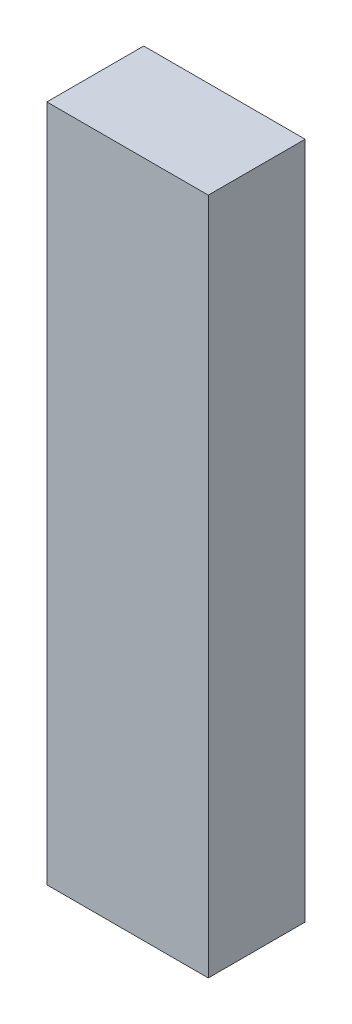
ISO-10303-21;
HEADER;
FILE_DESCRIPTION(('STEP AP214'),'2;1');
FILE_NAME('part.step','',(''),(''),'','','');
FILE_SCHEMA(('AUTOMOTIVE_DESIGN { 1 0 10303 214 1 1 1 1 }'));
ENDSEC;
DATA;
#1=APPLICATION_CONTEXT('core data for automotive mechanical design processes');
#2=APPLICATION_PROTOCOL_DEFINITION('international standard','automotive_design',2000,#1);
#3=PRODUCT_CONTEXT('',#1,'mechanical');
#4=PRODUCT('Part','Part','',(#3));
#5=PRODUCT_RELATED_PRODUCT_CATEGORY('part','',(#4));
#6=PRODUCT_DEFINITION_FORMATION('','',#4);
#7=PRODUCT_DEFINITION_CONTEXT('part definition',#1,'design');
#8=PRODUCT_DEFINITION('design','',#6,#7);
#9=PRODUCT_DEFINITION_SHAPE('','',#8);
#10=(LENGTH_UNIT() NAMED_UNIT(*) SI_UNIT(.MILLI.,.METRE.));
#11=(NAMED_UNIT(*) PLANE_ANGLE_UNIT() SI_UNIT($,.RADIAN.));
#12=(NAMED_UNIT(*) SI_UNIT($,.STERADIAN.) SOLID_ANGLE_UNIT());
#13=UNCERTAINTY_MEASURE_WITH_UNIT(LENGTH_MEASURE(1.E-05),#10,'distance_accuracy_value','');
#14=(GEOMETRIC_REPRESENTATION_CONTEXT(3) GLOBAL_UNCERTAINTY_ASSIGNED_CONTEXT((#13)) GLOBAL_UNIT_ASSIGNED_CONTEXT((#10,
#11,#12)) REPRESENTATION_CONTEXT('',''));
#15=CARTESIAN_POINT('',(0.,0.,0.));
#16=DIRECTION('',(0.,0.,1.));
#17=DIRECTION('',(1.,0.,0.));
#18=AXIS2_PLACEMENT_3D('',#15,#16,#17);
#19=CARTESIAN_POINT('',(0.,0.,7.62));
#20=DIRECTION('',(1.,0.,0.));
#21=DIRECTION('',(0.,1.,0.));
#22=AXIS2_PLACEMENT_3D('',#19,#20,#21);
#23=PLANE('',#22);
#24=DIRECTION('',(0.,-1.,0.));
#25=VECTOR('',#24,1.);
#26=CARTESIAN_POINT('',(0.,0.,0.));
#27=LINE('',#26,#25);
#28=CARTESIAN_POINT('',(0.,53.34,0.));
#29=VERTEX_POINT('',#28);
#30=CARTESIAN_POINT('',(0.,0.,0.));
#31=VERTEX_POINT('',#30);
#32=EDGE_CURVE('E96',#29,#31,#27,.T.);
#33=ORIENTED_EDGE('',*,*,#32,.T.);
#34=DIRECTION('',(0.,0.,-1.));
#35=VECTOR('',#34,1.);
#36=CARTESIAN_POINT('',(0.,0.,7.62));
#37=LINE('',#36,#35);
#38=CARTESIAN_POINT('',(0.,0.,7.62));
#39=VERTEX_POINT('',#38);
#40=EDGE_CURVE('E11',#39,#31,#37,.T.);
#41=ORIENTED_EDGE('',*,*,#40,.F.);
#42=DIRECTION('',(0.,-1.,0.));
#43=VECTOR('',#42,1.);
#44=CARTESIAN_POINT('',(0.,0.,7.62));
#45=LINE('',#44,#43);
#46=CARTESIAN_POINT('',(0.,53.34,7.62));
#47=VERTEX_POINT('',#46);
#48=EDGE_CURVE('E84',#47,#39,#45,.T.);
#49=ORIENTED_EDGE('',*,*,#48,.F.);
#50=DIRECTION('',(0.,0.,-1.));
#51=VECTOR('',#50,1.);
#52=CARTESIAN_POINT('',(0.,53.34,7.62));
#53=LINE('',#52,#51);
#54=EDGE_CURVE('E92',#47,#29,#53,.T.);
#55=ORIENTED_EDGE('',*,*,#54,.T.);
#56=EDGE_LOOP('',(#33,#41,#49,#55));
#57=FACE_BOUND('',#56,.T.);
#58=ADVANCED_FACE('F33',(#57),#23,.F.);
#59=CARTESIAN_POINT('',(0.,0.,7.62));
#60=DIRECTION('',(0.,1.,0.));
#61=DIRECTION('',(0.,0.,1.));
#62=AXIS2_PLACEMENT_3D('',#59,#60,#61);
#63=PLANE('',#62);
#64=DIRECTION('',(1.,0.,0.));
#65=VECTOR('',#64,1.);
#66=CARTESIAN_POINT('',(0.,0.,0.));
#67=LINE('',#66,#65);
#68=CARTESIAN_POINT('',(12.7,0.,0.));
#69=VERTEX_POINT('',#68);
#70=EDGE_CURVE('E88',#31,#69,#67,.T.);
#71=ORIENTED_EDGE('',*,*,#70,.T.);
#72=DIRECTION('',(0.,0.,-1.));
#73=VECTOR('',#72,1.);
#74=CARTESIAN_POINT('',(12.7,0.,7.62));
#75=LINE('',#74,#73);
#76=CARTESIAN_POINT('',(12.7,0.,7.62));
#77=VERTEX_POINT('',#76);
#78=EDGE_CURVE('E41',#77,#69,#75,.T.);
#79=ORIENTED_EDGE('',*,*,#78,.F.);
#80=DIRECTION('',(1.,0.,0.));
#81=VECTOR('',#80,1.);
#82=CARTESIAN_POINT('',(0.,0.,7.62));
#83=LINE('',#82,#81);
#84=EDGE_CURVE('E79',#39,#77,#83,.T.);
#85=ORIENTED_EDGE('',*,*,#84,.F.);
#86=ORIENTED_EDGE('',*,*,#40,.T.);
#87=EDGE_LOOP('',(#71,#79,#85,#86));
#88=FACE_BOUND('',#87,.T.);
#89=ADVANCED_FACE('F87',(#88),#63,.F.);
#90=CARTESIAN_POINT('',(12.7,0.,7.62));
#91=DIRECTION('',(-1.,0.,0.));
#92=DIRECTION('',(0.,-1.,0.));
#93=AXIS2_PLACEMENT_3D('',#90,#91,#92);
#94=PLANE('',#93);
#95=DIRECTION('',(0.,1.,0.));
#96=VECTOR('',#95,1.);
#97=CARTESIAN_POINT('',(12.7,0.,0.));
#98=LINE('',#97,#96);
#99=CARTESIAN_POINT('',(12.7,53.34,0.));
#100=VERTEX_POINT('',#99);
#101=EDGE_CURVE('E66',#69,#100,#98,.T.);
#102=ORIENTED_EDGE('',*,*,#101,.T.);
#103=DIRECTION('',(0.,0.,-1.));
#104=VECTOR('',#103,1.);
#105=CARTESIAN_POINT('',(12.7,53.34,7.62));
#106=LINE('',#105,#104);
#107=CARTESIAN_POINT('',(12.7,53.34,7.62));
#108=VERTEX_POINT('',#107);
#109=EDGE_CURVE('E89',#108,#100,#106,.T.);
#110=ORIENTED_EDGE('',*,*,#109,.F.);
#111=DIRECTION('',(0.,1.,0.));
#112=VECTOR('',#111,1.);
#113=CARTESIAN_POINT('',(12.7,0.,7.62));
#114=LINE('',#113,#112);
#115=EDGE_CURVE('E82',#77,#108,#114,.T.);
#116=ORIENTED_EDGE('',*,*,#115,.F.);
#117=ORIENTED_EDGE('',*,*,#78,.T.);
#118=EDGE_LOOP('',(#102,#110,#116,#117));
#119=FACE_BOUND('',#118,.T.);
#120=ADVANCED_FACE('F90',(#119),#94,.F.);
#121=CARTESIAN_POINT('',(0.,53.34,7.62));
#122=DIRECTION('',(0.,-1.,0.));
#123=DIRECTION('',(0.,0.,-1.));
#124=AXIS2_PLACEMENT_3D('',#121,#122,#123);
#125=PLANE('',#124);
#126=DIRECTION('',(-1.,0.,0.));
#127=VECTOR('',#126,1.);
#128=CARTESIAN_POINT('',(0.,53.34,0.));
#129=LINE('',#128,#127);
#130=EDGE_CURVE('E72',#100,#29,#129,.T.);
#131=ORIENTED_EDGE('',*,*,#130,.T.);
#132=ORIENTED_EDGE('',*,*,#54,.F.);
#133=DIRECTION('',(-1.,0.,0.));
#134=VECTOR('',#133,1.);
#135=CARTESIAN_POINT('',(0.,53.34,7.62));
#136=LINE('',#135,#134);
#137=EDGE_CURVE('E49',#108,#47,#136,.T.);
#138=ORIENTED_EDGE('',*,*,#137,.F.);
#139=ORIENTED_EDGE('',*,*,#109,.T.);
#140=EDGE_LOOP('',(#131,#132,#138,#139));
#141=FACE_BOUND('',#140,.T.);
#142=ADVANCED_FACE('F103',(#141),#125,.F.);
#143=CARTESIAN_POINT('',(0.,0.,7.62));
#144=DIRECTION('',(0.,0.,-1.));
#145=DIRECTION('',(-1.,0.,0.));
#146=AXIS2_PLACEMENT_3D('',#143,#144,#145);
#147=PLANE('',#146);
#148=ORIENTED_EDGE('',*,*,#48,.T.);
#149=ORIENTED_EDGE('',*,*,#84,.T.);
#150=ORIENTED_EDGE('',*,*,#115,.T.);
#151=ORIENTED_EDGE('',*,*,#137,.T.);
#152=EDGE_LOOP('',(#148,#149,#150,#151));
#153=FACE_BOUND('',#152,.T.);
#154=ADVANCED_FACE('F80',(#153),#147,.F.);
#155=CARTESIAN_POINT('',(0.,0.,0.));
#156=DIRECTION('',(0.,0.,-1.));
#157=DIRECTION('',(-1.,0.,0.));
#158=AXIS2_PLACEMENT_3D('',#155,#156,#157);
#159=PLANE('',#158);
#160=ORIENTED_EDGE('',*,*,#32,.F.);
#161=ORIENTED_EDGE('',*,*,#130,.F.);
#162=ORIENTED_EDGE('',*,*,#101,.F.);
#163=ORIENTED_EDGE('',*,*,#70,.F.);
#164=EDGE_LOOP('',(#160,#161,#162,#163));
#165=FACE_BOUND('',#164,.T.);
#166=ADVANCED_FACE('F106',(#165),#159,.T.);
#167=CLOSED_SHELL('',(#58,#89,#120,#142,#154,#166));
#168=MANIFOLD_SOLID_BREP('B2',#167);
#169=ADVANCED_BREP_SHAPE_REPRESENTATION('',(#18,#168),#14);
#170=SHAPE_DEFINITION_REPRESENTATION(#9,#169);
ENDSEC;
END-ISO-10303-21;
